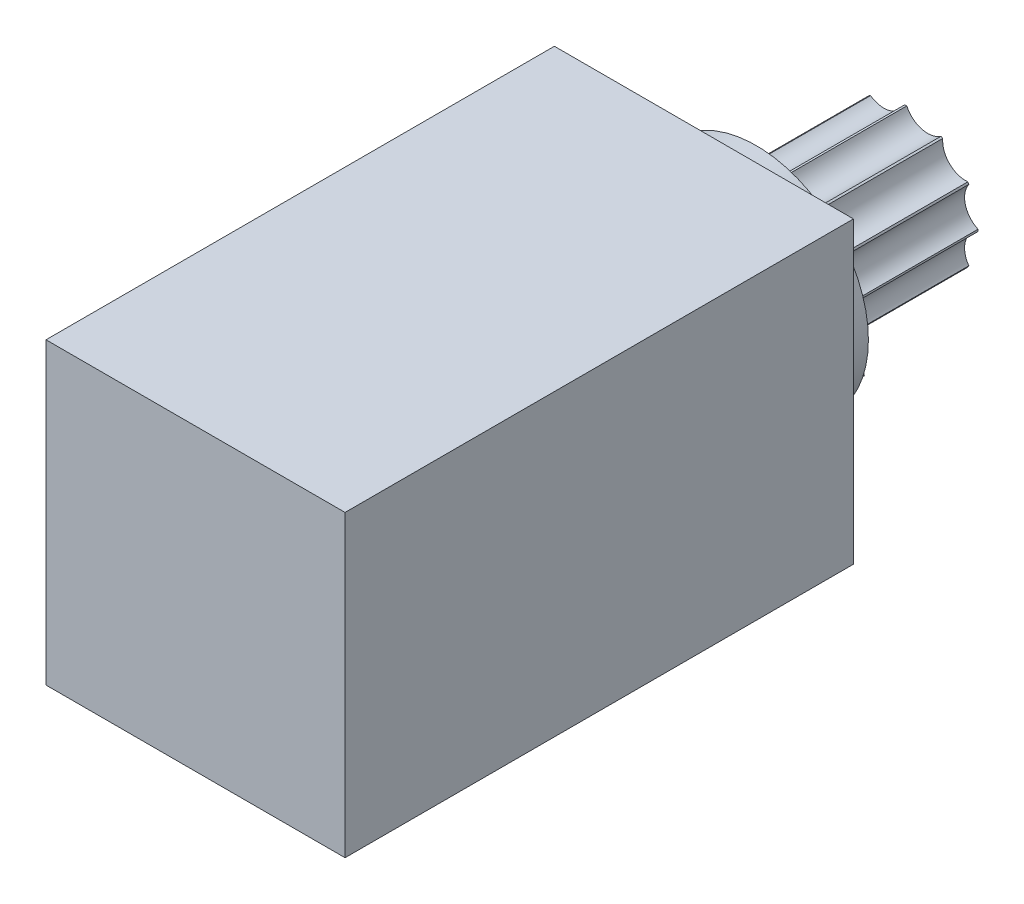
ISO-10303-21;
HEADER;
FILE_DESCRIPTION(('STEP AP214'),'2;1');
FILE_NAME('part.step','',(''),(''),'','','');
FILE_SCHEMA(('AUTOMOTIVE_DESIGN { 1 0 10303 214 1 1 1 1 }'));
ENDSEC;
DATA;
#1=APPLICATION_CONTEXT('core data for automotive mechanical design processes');
#2=APPLICATION_PROTOCOL_DEFINITION('international standard','automotive_design',2000,#1);
#3=PRODUCT_CONTEXT('',#1,'mechanical');
#4=PRODUCT('Part','Part','',(#3));
#5=PRODUCT_RELATED_PRODUCT_CATEGORY('part','',(#4));
#6=PRODUCT_DEFINITION_FORMATION('','',#4);
#7=PRODUCT_DEFINITION_CONTEXT('part definition',#1,'design');
#8=PRODUCT_DEFINITION('design','',#6,#7);
#9=PRODUCT_DEFINITION_SHAPE('','',#8);
#10=(LENGTH_UNIT() NAMED_UNIT(*) SI_UNIT(.MILLI.,.METRE.));
#11=(NAMED_UNIT(*) PLANE_ANGLE_UNIT() SI_UNIT($,.RADIAN.));
#12=(NAMED_UNIT(*) SI_UNIT($,.STERADIAN.) SOLID_ANGLE_UNIT());
#13=UNCERTAINTY_MEASURE_WITH_UNIT(LENGTH_MEASURE(1.E-05),#10,'distance_accuracy_value','');
#14=(GEOMETRIC_REPRESENTATION_CONTEXT(3) GLOBAL_UNCERTAINTY_ASSIGNED_CONTEXT((#13)) GLOBAL_UNIT_ASSIGNED_CONTEXT((#10,
#11,#12)) REPRESENTATION_CONTEXT('',''));
#15=CARTESIAN_POINT('',(0.,0.,0.));
#16=DIRECTION('',(0.,0.,1.));
#17=DIRECTION('',(1.,0.,0.));
#18=AXIS2_PLACEMENT_3D('',#15,#16,#17);
#19=CARTESIAN_POINT('',(0.,0.,0.));
#20=DIRECTION('',(0.,0.,1.));
#21=DIRECTION('',(1.,0.,0.));
#22=AXIS2_PLACEMENT_3D('',#19,#20,#21);
#23=PLANE('',#22);
#24=CARTESIAN_POINT('',(-2.93276025786936,10.9452102887896,0.));
#25=DIRECTION('',(0.,0.,1.));
#26=DIRECTION('',(-1.,0.,0.));
#27=AXIS2_PLACEMENT_3D('',#24,#25,#26);
#28=CIRCLE('',#27,3.08131550156367);
#29=CARTESIAN_POINT('',(-4.71396154001123,8.43088588396958,0.));
#30=VERTEX_POINT('',#29);
#31=CARTESIAN_POINT('',(-0.13303249587147,9.65834212193098,0.));
#32=VERTEX_POINT('',#31);
#33=EDGE_CURVE('E294',#30,#32,#28,.T.);
#34=ORIENTED_EDGE('',*,*,#33,.T.);
#35=DIRECTION('',(1.,0.,0.));
#36=VECTOR('',#35,1.);
#37=CARTESIAN_POINT('',(-0.13303249587147,9.65834212193098,0.));
#38=LINE('',#37,#36);
#39=CARTESIAN_POINT('',(0.133032495872285,9.65834212193096,0.));
#40=VERTEX_POINT('',#39);
#41=EDGE_CURVE('E367',#32,#40,#38,.T.);
#42=ORIENTED_EDGE('',*,*,#41,.T.);
#43=CARTESIAN_POINT('',(2.93276025787025,10.9452102887901,0.));
#44=DIRECTION('',(0.,0.,1.));
#45=DIRECTION('',(-1.,0.,0.));
#46=AXIS2_PLACEMENT_3D('',#43,#44,#45);
#47=CIRCLE('',#46,3.08131550156377);
#48=CARTESIAN_POINT('',(4.71396154001138,8.43088588396955,0.));
#49=VERTEX_POINT('',#48);
#50=EDGE_CURVE('E370',#40,#49,#47,.T.);
#51=ORIENTED_EDGE('',*,*,#50,.T.);
#52=DIRECTION('',(0.866025403784434,-0.500000000000009,0.));
#53=VECTOR('',#52,1.);
#54=CARTESIAN_POINT('',(4.71396154001135,8.43088588396959,0.));
#55=LINE('',#54,#53);
#56=CARTESIAN_POINT('',(4.94438058191977,8.29785338809734,0.));
#57=VERTEX_POINT('',#56);
#58=EDGE_CURVE('E373',#49,#57,#55,.T.);
#59=ORIENTED_EDGE('',*,*,#58,.T.);
#60=CARTESIAN_POINT('',(8.01245003092004,8.01245003091989,0.));
#61=DIRECTION('',(0.,0.,1.));
#62=DIRECTION('',(-1.,0.,0.));
#63=AXIS2_PLACEMENT_3D('',#60,#61,#62);
#64=CIRCLE('',#63,3.08131550156372);
#65=CARTESIAN_POINT('',(8.2978533880973,4.94438058191963,0.));
#66=VERTEX_POINT('',#65);
#67=EDGE_CURVE('E376',#57,#66,#64,.T.);
#68=ORIENTED_EDGE('',*,*,#67,.T.);
#69=DIRECTION('',(0.500000000000075,-0.866025403784395,0.));
#70=VECTOR('',#69,1.);
#71=CARTESIAN_POINT('',(8.2978533880973,4.94438058191965,0.));
#72=LINE('',#71,#70);
#73=CARTESIAN_POINT('',(8.43088588396965,4.7139615400111,0.));
#74=VERTEX_POINT('',#73);
#75=EDGE_CURVE('E379',#66,#74,#72,.T.);
#76=ORIENTED_EDGE('',*,*,#75,.T.);
#77=CARTESIAN_POINT('',(10.9452102887901,2.93276025787003,0.));
#78=DIRECTION('',(0.,0.,1.));
#79=DIRECTION('',(-1.,0.,0.));
#80=AXIS2_PLACEMENT_3D('',#77,#78,#79);
#81=CIRCLE('',#80,3.08131550156376);
#82=CARTESIAN_POINT('',(9.65834212193091,0.133032495872171,0.));
#83=VERTEX_POINT('',#82);
#84=EDGE_CURVE('E382',#74,#83,#81,.T.);
#85=ORIENTED_EDGE('',*,*,#84,.T.);
#86=DIRECTION('',(0.,-1.,0.));
#87=VECTOR('',#86,1.);
#88=CARTESIAN_POINT('',(9.65834212193089,0.133032495872123,0.));
#89=LINE('',#88,#87);
#90=CARTESIAN_POINT('',(9.65834212193088,-0.133032495872416,0.));
#91=VERTEX_POINT('',#90);
#92=EDGE_CURVE('E385',#83,#91,#89,.T.);
#93=ORIENTED_EDGE('',*,*,#92,.T.);
#94=CARTESIAN_POINT('',(10.9452102887901,-2.93276025787022,0.));
#95=DIRECTION('',(0.,0.,1.));
#96=DIRECTION('',(-1.,0.,0.));
#97=AXIS2_PLACEMENT_3D('',#94,#95,#96);
#98=CIRCLE('',#97,3.08131550156376);
#99=CARTESIAN_POINT('',(8.43088588396955,-4.71396154001132,0.));
#100=VERTEX_POINT('',#99);
#101=EDGE_CURVE('E388',#91,#100,#98,.T.);
#102=ORIENTED_EDGE('',*,*,#101,.T.);
#103=DIRECTION('',(-0.499999999999937,-0.866025403784475,0.));
#104=VECTOR('',#103,1.);
#105=CARTESIAN_POINT('',(8.4308858839695,-4.71396154001135,0.));
#106=LINE('',#105,#104);
#107=CARTESIAN_POINT('',(8.29785338809731,-4.94438058191973,0.));
#108=VERTEX_POINT('',#107);
#109=EDGE_CURVE('E391',#100,#108,#106,.T.);
#110=ORIENTED_EDGE('',*,*,#109,.T.);
#111=CARTESIAN_POINT('',(8.0124500309199,-8.01245003092004,0.));
#112=DIRECTION('',(0.,0.,1.));
#113=DIRECTION('',(-1.,0.,0.));
#114=AXIS2_PLACEMENT_3D('',#111,#112,#113);
#115=CIRCLE('',#114,3.08131550156379);
#116=CARTESIAN_POINT('',(4.94438058191957,-8.29785338809738,0.));
#117=VERTEX_POINT('',#116);
#118=EDGE_CURVE('E394',#108,#117,#115,.T.);
#119=ORIENTED_EDGE('',*,*,#118,.T.);
#120=DIRECTION('',(-0.866025403784444,-0.499999999999991,0.));
#121=VECTOR('',#120,1.);
#122=CARTESIAN_POINT('',(4.94438058191956,-8.29785338809738,0.));
#123=LINE('',#122,#121);
#124=CARTESIAN_POINT('',(4.71396154001119,-8.43088588396959,0.));
#125=VERTEX_POINT('',#124);
#126=EDGE_CURVE('E397',#117,#125,#123,.T.);
#127=ORIENTED_EDGE('',*,*,#126,.T.);
#128=CARTESIAN_POINT('',(2.93276025787003,-10.9452102887901,0.));
#129=DIRECTION('',(0.,0.,1.));
#130=DIRECTION('',(-1.,0.,0.));
#131=AXIS2_PLACEMENT_3D('',#128,#129,#130);
#132=CIRCLE('',#131,3.08131550156377);
#133=CARTESIAN_POINT('',(0.133032495872173,-9.65834212193088,0.));
#134=VERTEX_POINT('',#133);
#135=EDGE_CURVE('E400',#125,#134,#132,.T.);
#136=ORIENTED_EDGE('',*,*,#135,.T.);
#137=DIRECTION('',(-1.,0.,0.));
#138=VECTOR('',#137,1.);
#139=CARTESIAN_POINT('',(0.133032495872204,-9.6583421219309,0.));
#140=LINE('',#139,#138);
#141=CARTESIAN_POINT('',(-0.133032495872356,-9.6583421219309,0.));
#142=VERTEX_POINT('',#141);
#143=EDGE_CURVE('E403',#134,#142,#140,.T.);
#144=ORIENTED_EDGE('',*,*,#143,.T.);
#145=CARTESIAN_POINT('',(-2.93276025787022,-10.9452102887901,0.));
#146=DIRECTION('',(0.,0.,1.));
#147=DIRECTION('',(-1.,0.,0.));
#148=AXIS2_PLACEMENT_3D('',#145,#146,#147);
#149=CIRCLE('',#148,3.08131550156372);
#150=CARTESIAN_POINT('',(-4.71396154001126,-8.43088588396955,0.));
#151=VERTEX_POINT('',#150);
#152=EDGE_CURVE('E406',#142,#151,#149,.T.);
#153=ORIENTED_EDGE('',*,*,#152,.T.);
#154=DIRECTION('',(-0.866025403784452,0.499999999999976,0.));
#155=VECTOR('',#154,1.);
#156=CARTESIAN_POINT('',(-4.71396154001125,-8.43088588396957,0.));
#157=LINE('',#156,#155);
#158=CARTESIAN_POINT('',(-4.94438058191978,-8.29785338809727,0.));
#159=VERTEX_POINT('',#158);
#160=EDGE_CURVE('E409',#151,#159,#157,.T.);
#161=ORIENTED_EDGE('',*,*,#160,.T.);
#162=CARTESIAN_POINT('',(-8.01245003092006,-8.01245003091989,0.));
#163=DIRECTION('',(0.,0.,1.));
#164=DIRECTION('',(-1.,0.,0.));
#165=AXIS2_PLACEMENT_3D('',#162,#163,#164);
#166=CIRCLE('',#165,3.08131550156371);
#167=CARTESIAN_POINT('',(-8.29785338809734,-4.94438058191963,0.));
#168=VERTEX_POINT('',#167);
#169=EDGE_CURVE('E412',#159,#168,#166,.T.);
#170=ORIENTED_EDGE('',*,*,#169,.T.);
#171=DIRECTION('',(-0.499999999999894,0.8660254037845,0.));
#172=VECTOR('',#171,1.);
#173=CARTESIAN_POINT('',(-8.29785338809734,-4.94438058191965,0.));
#174=LINE('',#173,#172);
#175=CARTESIAN_POINT('',(-8.43088588396961,-4.71396154001113,0.));
#176=VERTEX_POINT('',#175);
#177=EDGE_CURVE('E415',#168,#176,#174,.T.);
#178=ORIENTED_EDGE('',*,*,#177,.T.);
#179=CARTESIAN_POINT('',(-10.9452102887901,-2.93276025787,0.));
#180=DIRECTION('',(0.,0.,1.));
#181=DIRECTION('',(-1.,0.,0.));
#182=AXIS2_PLACEMENT_3D('',#179,#180,#181);
#183=CIRCLE('',#182,3.08131550156374);
#184=CARTESIAN_POINT('',(-9.65834212193084,-0.133032495872213,0.));
#185=VERTEX_POINT('',#184);
#186=EDGE_CURVE('E418',#176,#185,#183,.T.);
#187=ORIENTED_EDGE('',*,*,#186,.T.);
#188=DIRECTION('',(0.,1.,0.));
#189=VECTOR('',#188,1.);
#190=CARTESIAN_POINT('',(-9.65834212193088,0.133032495872454,0.));
#191=LINE('',#190,#189);
#192=CARTESIAN_POINT('',(-9.65834212193088,0.133032495872454,0.));
#193=VERTEX_POINT('',#192);
#194=EDGE_CURVE('E421',#185,#193,#191,.T.);
#195=ORIENTED_EDGE('',*,*,#194,.T.);
#196=CARTESIAN_POINT('',(-10.9452102887901,2.93276025787025,0.));
#197=DIRECTION('',(0.,0.,1.));
#198=DIRECTION('',(-1.,0.,0.));
#199=AXIS2_PLACEMENT_3D('',#196,#197,#198);
#200=CIRCLE('',#199,3.08131550156368);
#201=CARTESIAN_POINT('',(-8.43088588396956,4.71396154001123,0.));
#202=VERTEX_POINT('',#201);
#203=EDGE_CURVE('E424',#193,#202,#200,.T.);
#204=ORIENTED_EDGE('',*,*,#203,.T.);
#205=DIRECTION('',(0.5,0.866025403784439,0.));
#206=VECTOR('',#205,1.);
#207=CARTESIAN_POINT('',(-8.29785338809726,4.94438058191977,0.));
#208=LINE('',#207,#206);
#209=CARTESIAN_POINT('',(-8.29785338809726,4.94438058191977,0.));
#210=VERTEX_POINT('',#209);
#211=EDGE_CURVE('E427',#202,#210,#208,.T.);
#212=ORIENTED_EDGE('',*,*,#211,.T.);
#213=CARTESIAN_POINT('',(-8.01245003091988,8.01245003092007,0.));
#214=DIRECTION('',(0.,0.,1.));
#215=DIRECTION('',(-1.,0.,0.));
#216=AXIS2_PLACEMENT_3D('',#213,#214,#215);
#217=CIRCLE('',#216,3.08131550156373);
#218=CARTESIAN_POINT('',(-4.9443805819196,8.29785338809735,0.));
#219=VERTEX_POINT('',#218);
#220=EDGE_CURVE('E430',#210,#219,#217,.T.);
#221=ORIENTED_EDGE('',*,*,#220,.T.);
#222=DIRECTION('',(0.866025403784433,0.50000000000001,0.));
#223=VECTOR('',#222,1.);
#224=CARTESIAN_POINT('',(-4.71396154001123,8.43088588396958,0.));
#225=LINE('',#224,#223);
#226=EDGE_CURVE('E299',#219,#30,#225,.T.);
#227=ORIENTED_EDGE('',*,*,#226,.T.);
#228=EDGE_LOOP('',(#34,#42,#51,#59,#68,#76,#85,#93,#102,#110,#119,#127,#136,#144,#153,#161,#170,
#178,#187,#195,#204,#212,#221,#227));
#229=FACE_BOUND('',#228,.T.);
#230=ADVANCED_FACE('F50',(#229),#23,.F.);
#231=CARTESIAN_POINT('',(-2.93276025786936,10.9452102887896,20.));
#232=DIRECTION('',(0.,0.,-1.));
#233=DIRECTION('',(-1.,0.,0.));
#234=AXIS2_PLACEMENT_3D('',#231,#232,#233);
#235=CYLINDRICAL_SURFACE('',#234,3.08131550156367);
#236=ORIENTED_EDGE('',*,*,#33,.F.);
#237=DIRECTION('',(0.,0.,-1.));
#238=VECTOR('',#237,1.);
#239=CARTESIAN_POINT('',(-4.71396154001123,8.43088588396958,20.));
#240=LINE('',#239,#238);
#241=CARTESIAN_POINT('',(-4.71396154001123,8.43088588396958,20.));
#242=VERTEX_POINT('',#241);
#243=EDGE_CURVE('E12',#242,#30,#240,.T.);
#244=ORIENTED_EDGE('',*,*,#243,.F.);
#245=CARTESIAN_POINT('',(-2.93276025786936,10.9452102887896,20.));
#246=DIRECTION('',(0.,0.,1.));
#247=DIRECTION('',(-1.,0.,0.));
#248=AXIS2_PLACEMENT_3D('',#245,#246,#247);
#249=CIRCLE('',#248,3.08131550156367);
#250=CARTESIAN_POINT('',(-0.13303249587147,9.65834212193098,20.));
#251=VERTEX_POINT('',#250);
#252=EDGE_CURVE('E295',#242,#251,#249,.T.);
#253=ORIENTED_EDGE('',*,*,#252,.T.);
#254=DIRECTION('',(0.,0.,-1.));
#255=VECTOR('',#254,1.);
#256=CARTESIAN_POINT('',(-0.13303249587147,9.65834212193098,20.));
#257=LINE('',#256,#255);
#258=EDGE_CURVE('E53',#251,#32,#257,.T.);
#259=ORIENTED_EDGE('',*,*,#258,.T.);
#260=EDGE_LOOP('',(#236,#244,#253,#259));
#261=FACE_BOUND('',#260,.T.);
#262=ADVANCED_FACE('F486',(#261),#235,.F.);
#263=CARTESIAN_POINT('',(-4.71396154001123,8.43088588396958,20.));
#264=DIRECTION('',(-0.50000000000001,0.866025403784433,0.));
#265=DIRECTION('',(-0.866025403784433,-0.50000000000001,0.));
#266=AXIS2_PLACEMENT_3D('',#263,#264,#265);
#267=PLANE('',#266);
#268=ORIENTED_EDGE('',*,*,#226,.F.);
#269=DIRECTION('',(0.,0.,-1.));
#270=VECTOR('',#269,1.);
#271=CARTESIAN_POINT('',(-4.9443805819196,8.29785338809735,20.));
#272=LINE('',#271,#270);
#273=CARTESIAN_POINT('',(-4.9443805819196,8.29785338809735,20.));
#274=VERTEX_POINT('',#273);
#275=EDGE_CURVE('E58',#274,#219,#272,.T.);
#276=ORIENTED_EDGE('',*,*,#275,.F.);
#277=DIRECTION('',(0.866025403784433,0.50000000000001,0.));
#278=VECTOR('',#277,1.);
#279=CARTESIAN_POINT('',(-4.71396154001123,8.43088588396958,20.));
#280=LINE('',#279,#278);
#281=EDGE_CURVE('E362',#274,#242,#280,.T.);
#282=ORIENTED_EDGE('',*,*,#281,.T.);
#283=ORIENTED_EDGE('',*,*,#243,.T.);
#284=EDGE_LOOP('',(#268,#276,#282,#283));
#285=FACE_BOUND('',#284,.T.);
#286=ADVANCED_FACE('F494',(#285),#267,.T.);
#287=CARTESIAN_POINT('',(-8.01245003091988,8.01245003092007,20.));
#288=DIRECTION('',(0.,0.,-1.));
#289=DIRECTION('',(-1.,0.,0.));
#290=AXIS2_PLACEMENT_3D('',#287,#288,#289);
#291=CYLINDRICAL_SURFACE('',#290,3.08131550156373);
#292=ORIENTED_EDGE('',*,*,#220,.F.);
#293=DIRECTION('',(0.,0.,-1.));
#294=VECTOR('',#293,1.);
#295=CARTESIAN_POINT('',(-8.29785338809726,4.94438058191977,20.));
#296=LINE('',#295,#294);
#297=CARTESIAN_POINT('',(-8.29785338809726,4.94438058191977,20.));
#298=VERTEX_POINT('',#297);
#299=EDGE_CURVE('E436',#298,#210,#296,.T.);
#300=ORIENTED_EDGE('',*,*,#299,.F.);
#301=CARTESIAN_POINT('',(-8.01245003091988,8.01245003092007,20.));
#302=DIRECTION('',(0.,0.,1.));
#303=DIRECTION('',(-1.,0.,0.));
#304=AXIS2_PLACEMENT_3D('',#301,#302,#303);
#305=CIRCLE('',#304,3.08131550156373);
#306=EDGE_CURVE('E359',#298,#274,#305,.T.);
#307=ORIENTED_EDGE('',*,*,#306,.T.);
#308=ORIENTED_EDGE('',*,*,#275,.T.);
#309=EDGE_LOOP('',(#292,#300,#307,#308));
#310=FACE_BOUND('',#309,.T.);
#311=ADVANCED_FACE('F580',(#310),#291,.F.);
#312=CARTESIAN_POINT('',(-8.29785338809726,4.94438058191977,20.));
#313=DIRECTION('',(-0.866025403784439,0.5,0.));
#314=DIRECTION('',(-0.5,-0.866025403784439,0.));
#315=AXIS2_PLACEMENT_3D('',#312,#313,#314);
#316=PLANE('',#315);
#317=ORIENTED_EDGE('',*,*,#211,.F.);
#318=DIRECTION('',(0.,0.,-1.));
#319=VECTOR('',#318,1.);
#320=CARTESIAN_POINT('',(-8.43088588396956,4.71396154001123,20.));
#321=LINE('',#320,#319);
#322=CARTESIAN_POINT('',(-8.43088588396956,4.71396154001123,20.));
#323=VERTEX_POINT('',#322);
#324=EDGE_CURVE('E438',#323,#202,#321,.T.);
#325=ORIENTED_EDGE('',*,*,#324,.F.);
#326=DIRECTION('',(0.5,0.866025403784439,0.));
#327=VECTOR('',#326,1.);
#328=CARTESIAN_POINT('',(-8.29785338809726,4.94438058191977,20.));
#329=LINE('',#328,#327);
#330=EDGE_CURVE('E356',#323,#298,#329,.T.);
#331=ORIENTED_EDGE('',*,*,#330,.T.);
#332=ORIENTED_EDGE('',*,*,#299,.T.);
#333=EDGE_LOOP('',(#317,#325,#331,#332));
#334=FACE_BOUND('',#333,.T.);
#335=ADVANCED_FACE('F578',(#334),#316,.T.);
#336=CARTESIAN_POINT('',(-10.9452102887901,2.93276025787025,20.));
#337=DIRECTION('',(0.,0.,-1.));
#338=DIRECTION('',(-1.,0.,0.));
#339=AXIS2_PLACEMENT_3D('',#336,#337,#338);
#340=CYLINDRICAL_SURFACE('',#339,3.08131550156368);
#341=ORIENTED_EDGE('',*,*,#203,.F.);
#342=DIRECTION('',(0.,0.,-1.));
#343=VECTOR('',#342,1.);
#344=CARTESIAN_POINT('',(-9.65834212193088,0.133032495872454,20.));
#345=LINE('',#344,#343);
#346=CARTESIAN_POINT('',(-9.65834212193088,0.133032495872454,20.));
#347=VERTEX_POINT('',#346);
#348=EDGE_CURVE('E440',#347,#193,#345,.T.);
#349=ORIENTED_EDGE('',*,*,#348,.F.);
#350=CARTESIAN_POINT('',(-10.9452102887901,2.93276025787025,20.));
#351=DIRECTION('',(0.,0.,1.));
#352=DIRECTION('',(-1.,0.,0.));
#353=AXIS2_PLACEMENT_3D('',#350,#351,#352);
#354=CIRCLE('',#353,3.08131550156368);
#355=EDGE_CURVE('E353',#347,#323,#354,.T.);
#356=ORIENTED_EDGE('',*,*,#355,.T.);
#357=ORIENTED_EDGE('',*,*,#324,.T.);
#358=EDGE_LOOP('',(#341,#349,#356,#357));
#359=FACE_BOUND('',#358,.T.);
#360=ADVANCED_FACE('F574',(#359),#340,.F.);
#361=CARTESIAN_POINT('',(-9.65834212193088,0.133032495872454,20.));
#362=DIRECTION('',(-1.,0.,0.));
#363=DIRECTION('',(0.,-1.,0.));
#364=AXIS2_PLACEMENT_3D('',#361,#362,#363);
#365=PLANE('',#364);
#366=ORIENTED_EDGE('',*,*,#194,.F.);
#367=DIRECTION('',(0.,0.,-1.));
#368=VECTOR('',#367,1.);
#369=CARTESIAN_POINT('',(-9.65834212193084,-0.133032495872213,20.));
#370=LINE('',#369,#368);
#371=CARTESIAN_POINT('',(-9.65834212193084,-0.133032495872213,20.));
#372=VERTEX_POINT('',#371);
#373=EDGE_CURVE('E442',#372,#185,#370,.T.);
#374=ORIENTED_EDGE('',*,*,#373,.F.);
#375=DIRECTION('',(0.,1.,0.));
#376=VECTOR('',#375,1.);
#377=CARTESIAN_POINT('',(-9.65834212193088,0.133032495872454,20.));
#378=LINE('',#377,#376);
#379=EDGE_CURVE('E350',#372,#347,#378,.T.);
#380=ORIENTED_EDGE('',*,*,#379,.T.);
#381=ORIENTED_EDGE('',*,*,#348,.T.);
#382=EDGE_LOOP('',(#366,#374,#380,#381));
#383=FACE_BOUND('',#382,.T.);
#384=ADVANCED_FACE('F570',(#383),#365,.T.);
#385=CARTESIAN_POINT('',(-10.9452102887901,-2.93276025787,20.));
#386=DIRECTION('',(0.,0.,-1.));
#387=DIRECTION('',(-1.,0.,0.));
#388=AXIS2_PLACEMENT_3D('',#385,#386,#387);
#389=CYLINDRICAL_SURFACE('',#388,3.08131550156374);
#390=ORIENTED_EDGE('',*,*,#186,.F.);
#391=DIRECTION('',(0.,0.,-1.));
#392=VECTOR('',#391,1.);
#393=CARTESIAN_POINT('',(-8.43088588396961,-4.71396154001113,20.));
#394=LINE('',#393,#392);
#395=CARTESIAN_POINT('',(-8.43088588396961,-4.71396154001113,20.));
#396=VERTEX_POINT('',#395);
#397=EDGE_CURVE('E444',#396,#176,#394,.T.);
#398=ORIENTED_EDGE('',*,*,#397,.F.);
#399=CARTESIAN_POINT('',(-10.9452102887901,-2.93276025787,20.));
#400=DIRECTION('',(0.,0.,1.));
#401=DIRECTION('',(-1.,0.,0.));
#402=AXIS2_PLACEMENT_3D('',#399,#400,#401);
#403=CIRCLE('',#402,3.08131550156374);
#404=EDGE_CURVE('E347',#396,#372,#403,.T.);
#405=ORIENTED_EDGE('',*,*,#404,.T.);
#406=ORIENTED_EDGE('',*,*,#373,.T.);
#407=EDGE_LOOP('',(#390,#398,#405,#406));
#408=FACE_BOUND('',#407,.T.);
#409=ADVANCED_FACE('F567',(#408),#389,.F.);
#410=CARTESIAN_POINT('',(-8.29785338809734,-4.94438058191965,20.));
#411=DIRECTION('',(-0.8660254037845,-0.499999999999894,0.));
#412=DIRECTION('',(0.499999999999894,-0.8660254037845,0.));
#413=AXIS2_PLACEMENT_3D('',#410,#411,#412);
#414=PLANE('',#413);
#415=ORIENTED_EDGE('',*,*,#177,.F.);
#416=DIRECTION('',(0.,0.,-1.));
#417=VECTOR('',#416,1.);
#418=CARTESIAN_POINT('',(-8.29785338809734,-4.94438058191963,20.));
#419=LINE('',#418,#417);
#420=CARTESIAN_POINT('',(-8.29785338809734,-4.94438058191963,20.));
#421=VERTEX_POINT('',#420);
#422=EDGE_CURVE('E446',#421,#168,#419,.T.);
#423=ORIENTED_EDGE('',*,*,#422,.F.);
#424=DIRECTION('',(-0.499999999999894,0.8660254037845,0.));
#425=VECTOR('',#424,1.);
#426=CARTESIAN_POINT('',(-8.29785338809734,-4.94438058191965,20.));
#427=LINE('',#426,#425);
#428=EDGE_CURVE('E344',#421,#396,#427,.T.);
#429=ORIENTED_EDGE('',*,*,#428,.T.);
#430=ORIENTED_EDGE('',*,*,#397,.T.);
#431=EDGE_LOOP('',(#415,#423,#429,#430));
#432=FACE_BOUND('',#431,.T.);
#433=ADVANCED_FACE('F562',(#432),#414,.T.);
#434=CARTESIAN_POINT('',(-8.01245003092006,-8.01245003091989,20.));
#435=DIRECTION('',(0.,0.,-1.));
#436=DIRECTION('',(-1.,0.,0.));
#437=AXIS2_PLACEMENT_3D('',#434,#435,#436);
#438=CYLINDRICAL_SURFACE('',#437,3.08131550156371);
#439=ORIENTED_EDGE('',*,*,#169,.F.);
#440=DIRECTION('',(0.,0.,-1.));
#441=VECTOR('',#440,1.);
#442=CARTESIAN_POINT('',(-4.94438058191978,-8.29785338809727,20.));
#443=LINE('',#442,#441);
#444=CARTESIAN_POINT('',(-4.94438058191978,-8.29785338809727,20.));
#445=VERTEX_POINT('',#444);
#446=EDGE_CURVE('E448',#445,#159,#443,.T.);
#447=ORIENTED_EDGE('',*,*,#446,.F.);
#448=CARTESIAN_POINT('',(-8.01245003092006,-8.01245003091989,20.));
#449=DIRECTION('',(0.,0.,1.));
#450=DIRECTION('',(-1.,0.,0.));
#451=AXIS2_PLACEMENT_3D('',#448,#449,#450);
#452=CIRCLE('',#451,3.08131550156371);
#453=EDGE_CURVE('E341',#445,#421,#452,.T.);
#454=ORIENTED_EDGE('',*,*,#453,.T.);
#455=ORIENTED_EDGE('',*,*,#422,.T.);
#456=EDGE_LOOP('',(#439,#447,#454,#455));
#457=FACE_BOUND('',#456,.T.);
#458=ADVANCED_FACE('F558',(#457),#438,.F.);
#459=CARTESIAN_POINT('',(-4.71396154001125,-8.43088588396957,20.));
#460=DIRECTION('',(-0.499999999999976,-0.866025403784452,0.));
#461=DIRECTION('',(0.866025403784452,-0.499999999999976,0.));
#462=AXIS2_PLACEMENT_3D('',#459,#460,#461);
#463=PLANE('',#462);
#464=ORIENTED_EDGE('',*,*,#160,.F.);
#465=DIRECTION('',(0.,0.,-1.));
#466=VECTOR('',#465,1.);
#467=CARTESIAN_POINT('',(-4.71396154001126,-8.43088588396955,20.));
#468=LINE('',#467,#466);
#469=CARTESIAN_POINT('',(-4.71396154001126,-8.43088588396955,20.));
#470=VERTEX_POINT('',#469);
#471=EDGE_CURVE('E450',#470,#151,#468,.T.);
#472=ORIENTED_EDGE('',*,*,#471,.F.);
#473=DIRECTION('',(-0.866025403784452,0.499999999999976,0.));
#474=VECTOR('',#473,1.);
#475=CARTESIAN_POINT('',(-4.71396154001125,-8.43088588396957,20.));
#476=LINE('',#475,#474);
#477=EDGE_CURVE('E338',#470,#445,#476,.T.);
#478=ORIENTED_EDGE('',*,*,#477,.T.);
#479=ORIENTED_EDGE('',*,*,#446,.T.);
#480=EDGE_LOOP('',(#464,#472,#478,#479));
#481=FACE_BOUND('',#480,.T.);
#482=ADVANCED_FACE('F555',(#481),#463,.T.);
#483=CARTESIAN_POINT('',(-2.93276025787022,-10.9452102887901,20.));
#484=DIRECTION('',(0.,0.,-1.));
#485=DIRECTION('',(-1.,0.,0.));
#486=AXIS2_PLACEMENT_3D('',#483,#484,#485);
#487=CYLINDRICAL_SURFACE('',#486,3.08131550156372);
#488=ORIENTED_EDGE('',*,*,#152,.F.);
#489=DIRECTION('',(0.,0.,-1.));
#490=VECTOR('',#489,1.);
#491=CARTESIAN_POINT('',(-0.133032495872356,-9.6583421219309,20.));
#492=LINE('',#491,#490);
#493=CARTESIAN_POINT('',(-0.133032495872356,-9.6583421219309,20.));
#494=VERTEX_POINT('',#493);
#495=EDGE_CURVE('E452',#494,#142,#492,.T.);
#496=ORIENTED_EDGE('',*,*,#495,.F.);
#497=CARTESIAN_POINT('',(-2.93276025787022,-10.9452102887901,20.));
#498=DIRECTION('',(0.,0.,1.));
#499=DIRECTION('',(-1.,0.,0.));
#500=AXIS2_PLACEMENT_3D('',#497,#498,#499);
#501=CIRCLE('',#500,3.08131550156372);
#502=EDGE_CURVE('E335',#494,#470,#501,.T.);
#503=ORIENTED_EDGE('',*,*,#502,.T.);
#504=ORIENTED_EDGE('',*,*,#471,.T.);
#505=EDGE_LOOP('',(#488,#496,#503,#504));
#506=FACE_BOUND('',#505,.T.);
#507=ADVANCED_FACE('F550',(#506),#487,.F.);
#508=CARTESIAN_POINT('',(0.133032495872204,-9.6583421219309,20.));
#509=DIRECTION('',(0.,-1.,0.));
#510=DIRECTION('',(1.,0.,0.));
#511=AXIS2_PLACEMENT_3D('',#508,#509,#510);
#512=PLANE('',#511);
#513=ORIENTED_EDGE('',*,*,#143,.F.);
#514=DIRECTION('',(0.,0.,-1.));
#515=VECTOR('',#514,1.);
#516=CARTESIAN_POINT('',(0.133032495872173,-9.65834212193088,20.));
#517=LINE('',#516,#515);
#518=CARTESIAN_POINT('',(0.133032495872173,-9.65834212193088,20.));
#519=VERTEX_POINT('',#518);
#520=EDGE_CURVE('E454',#519,#134,#517,.T.);
#521=ORIENTED_EDGE('',*,*,#520,.F.);
#522=DIRECTION('',(-1.,0.,0.));
#523=VECTOR('',#522,1.);
#524=CARTESIAN_POINT('',(0.133032495872204,-9.6583421219309,20.));
#525=LINE('',#524,#523);
#526=EDGE_CURVE('E332',#519,#494,#525,.T.);
#527=ORIENTED_EDGE('',*,*,#526,.T.);
#528=ORIENTED_EDGE('',*,*,#495,.T.);
#529=EDGE_LOOP('',(#513,#521,#527,#528));
#530=FACE_BOUND('',#529,.T.);
#531=ADVANCED_FACE('F546',(#530),#512,.T.);
#532=CARTESIAN_POINT('',(2.93276025787003,-10.9452102887901,20.));
#533=DIRECTION('',(0.,0.,-1.));
#534=DIRECTION('',(-1.,0.,0.));
#535=AXIS2_PLACEMENT_3D('',#532,#533,#534);
#536=CYLINDRICAL_SURFACE('',#535,3.08131550156377);
#537=ORIENTED_EDGE('',*,*,#135,.F.);
#538=DIRECTION('',(0.,0.,-1.));
#539=VECTOR('',#538,1.);
#540=CARTESIAN_POINT('',(4.71396154001119,-8.43088588396959,20.));
#541=LINE('',#540,#539);
#542=CARTESIAN_POINT('',(4.71396154001119,-8.43088588396959,20.));
#543=VERTEX_POINT('',#542);
#544=EDGE_CURVE('E456',#543,#125,#541,.T.);
#545=ORIENTED_EDGE('',*,*,#544,.F.);
#546=CARTESIAN_POINT('',(2.93276025787003,-10.9452102887901,20.));
#547=DIRECTION('',(0.,0.,1.));
#548=DIRECTION('',(-1.,0.,0.));
#549=AXIS2_PLACEMENT_3D('',#546,#547,#548);
#550=CIRCLE('',#549,3.08131550156377);
#551=EDGE_CURVE('E329',#543,#519,#550,.T.);
#552=ORIENTED_EDGE('',*,*,#551,.T.);
#553=ORIENTED_EDGE('',*,*,#520,.T.);
#554=EDGE_LOOP('',(#537,#545,#552,#553));
#555=FACE_BOUND('',#554,.T.);
#556=ADVANCED_FACE('F543',(#555),#536,.F.);
#557=CARTESIAN_POINT('',(4.94438058191956,-8.29785338809738,20.));
#558=DIRECTION('',(0.499999999999991,-0.866025403784444,0.));
#559=DIRECTION('',(0.866025403784444,0.499999999999991,0.));
#560=AXIS2_PLACEMENT_3D('',#557,#558,#559);
#561=PLANE('',#560);
#562=ORIENTED_EDGE('',*,*,#126,.F.);
#563=DIRECTION('',(0.,0.,-1.));
#564=VECTOR('',#563,1.);
#565=CARTESIAN_POINT('',(4.94438058191957,-8.29785338809738,20.));
#566=LINE('',#565,#564);
#567=CARTESIAN_POINT('',(4.94438058191957,-8.29785338809738,15.));
#568=VERTEX_POINT('',#567);
#569=EDGE_CURVE('E460',#568,#117,#566,.T.);
#570=ORIENTED_EDGE('',*,*,#569,.F.);
#571=CARTESIAN_POINT('',(4.94438058191957,-8.29785338809738,20.));
#572=VERTEX_POINT('',#571);
#573=EDGE_CURVE('E458',#572,#568,#566,.T.);
#574=ORIENTED_EDGE('',*,*,#573,.F.);
#575=DIRECTION('',(-0.866025403784444,-0.499999999999991,0.));
#576=VECTOR('',#575,1.);
#577=CARTESIAN_POINT('',(4.94438058191956,-8.29785338809738,20.));
#578=LINE('',#577,#576);
#579=EDGE_CURVE('E326',#572,#543,#578,.T.);
#580=ORIENTED_EDGE('',*,*,#579,.T.);
#581=ORIENTED_EDGE('',*,*,#544,.T.);
#582=EDGE_LOOP('',(#562,#570,#574,#580,#581));
#583=FACE_BOUND('',#582,.T.);
#584=ADVANCED_FACE('F538',(#583),#561,.T.);
#585=CARTESIAN_POINT('',(8.0124500309199,-8.01245003092004,20.));
#586=DIRECTION('',(0.,0.,-1.));
#587=DIRECTION('',(-1.,0.,0.));
#588=AXIS2_PLACEMENT_3D('',#585,#586,#587);
#589=CYLINDRICAL_SURFACE('',#588,3.08131550156379);
#590=CARTESIAN_POINT('',(8.0124500309199,-8.01245003092004,15.));
#591=DIRECTION('',(0.,0.,-1.));
#592=DIRECTION('',(-1.,0.,0.));
#593=AXIS2_PLACEMENT_3D('',#590,#591,#592);
#594=CIRCLE('',#593,3.08131550156379);
#595=CARTESIAN_POINT('',(8.29785338809731,-4.94438058191973,15.));
#596=VERTEX_POINT('',#595);
#597=EDGE_CURVE('E284',#568,#596,#594,.T.);
#598=ORIENTED_EDGE('',*,*,#597,.F.);
#599=ORIENTED_EDGE('',*,*,#569,.T.);
#600=ORIENTED_EDGE('',*,*,#118,.F.);
#601=DIRECTION('',(0.,0.,-1.));
#602=VECTOR('',#601,1.);
#603=CARTESIAN_POINT('',(8.29785338809731,-4.94438058191973,20.));
#604=LINE('',#603,#602);
#605=EDGE_CURVE('E464',#596,#108,#604,.T.);
#606=ORIENTED_EDGE('',*,*,#605,.F.);
#607=EDGE_LOOP('',(#598,#599,#600,#606));
#608=FACE_BOUND('',#607,.T.);
#609=ADVANCED_FACE('F533',(#608),#589,.F.);
#610=CARTESIAN_POINT('',(8.4308858839695,-4.71396154001135,20.));
#611=DIRECTION('',(0.866025403784475,-0.499999999999937,0.));
#612=DIRECTION('',(0.499999999999937,0.866025403784475,0.));
#613=AXIS2_PLACEMENT_3D('',#610,#611,#612);
#614=PLANE('',#613);
#615=ORIENTED_EDGE('',*,*,#109,.F.);
#616=DIRECTION('',(0.,0.,-1.));
#617=VECTOR('',#616,1.);
#618=CARTESIAN_POINT('',(8.43088588396955,-4.71396154001132,20.));
#619=LINE('',#618,#617);
#620=CARTESIAN_POINT('',(8.43088588396955,-4.71396154001132,20.));
#621=VERTEX_POINT('',#620);
#622=EDGE_CURVE('E465',#621,#100,#619,.T.);
#623=ORIENTED_EDGE('',*,*,#622,.F.);
#624=DIRECTION('',(-0.499999999999937,-0.866025403784475,0.));
#625=VECTOR('',#624,1.);
#626=CARTESIAN_POINT('',(8.4308858839695,-4.71396154001135,20.));
#627=LINE('',#626,#625);
#628=CARTESIAN_POINT('',(8.29785338809731,-4.94438058191973,20.));
#629=VERTEX_POINT('',#628);
#630=EDGE_CURVE('E323',#621,#629,#627,.T.);
#631=ORIENTED_EDGE('',*,*,#630,.T.);
#632=EDGE_CURVE('E461',#629,#596,#604,.T.);
#633=ORIENTED_EDGE('',*,*,#632,.T.);
#634=ORIENTED_EDGE('',*,*,#605,.T.);
#635=EDGE_LOOP('',(#615,#623,#631,#633,#634));
#636=FACE_BOUND('',#635,.T.);
#637=ADVANCED_FACE('F529',(#636),#614,.T.);
#638=CARTESIAN_POINT('',(10.9452102887901,-2.93276025787022,20.));
#639=DIRECTION('',(0.,0.,-1.));
#640=DIRECTION('',(-1.,0.,0.));
#641=AXIS2_PLACEMENT_3D('',#638,#639,#640);
#642=CYLINDRICAL_SURFACE('',#641,3.08131550156376);
#643=ORIENTED_EDGE('',*,*,#101,.F.);
#644=DIRECTION('',(0.,0.,-1.));
#645=VECTOR('',#644,1.);
#646=CARTESIAN_POINT('',(9.65834212193088,-0.133032495872416,20.));
#647=LINE('',#646,#645);
#648=CARTESIAN_POINT('',(9.65834212193088,-0.133032495872416,20.));
#649=VERTEX_POINT('',#648);
#650=EDGE_CURVE('E467',#649,#91,#647,.T.);
#651=ORIENTED_EDGE('',*,*,#650,.F.);
#652=CARTESIAN_POINT('',(10.9452102887901,-2.93276025787022,20.));
#653=DIRECTION('',(0.,0.,1.));
#654=DIRECTION('',(-1.,0.,0.));
#655=AXIS2_PLACEMENT_3D('',#652,#653,#654);
#656=CIRCLE('',#655,3.08131550156376);
#657=EDGE_CURVE('E320',#649,#621,#656,.T.);
#658=ORIENTED_EDGE('',*,*,#657,.T.);
#659=ORIENTED_EDGE('',*,*,#622,.T.);
#660=EDGE_LOOP('',(#643,#651,#658,#659));
#661=FACE_BOUND('',#660,.T.);
#662=ADVANCED_FACE('F524',(#661),#642,.F.);
#663=CARTESIAN_POINT('',(9.65834212193089,0.133032495872123,20.));
#664=DIRECTION('',(1.,0.,0.));
#665=DIRECTION('',(0.,1.,0.));
#666=AXIS2_PLACEMENT_3D('',#663,#664,#665);
#667=PLANE('',#666);
#668=ORIENTED_EDGE('',*,*,#92,.F.);
#669=DIRECTION('',(0.,0.,-1.));
#670=VECTOR('',#669,1.);
#671=CARTESIAN_POINT('',(9.65834212193091,0.133032495872171,20.));
#672=LINE('',#671,#670);
#673=CARTESIAN_POINT('',(9.65834212193091,0.133032495872171,20.));
#674=VERTEX_POINT('',#673);
#675=EDGE_CURVE('E469',#674,#83,#672,.T.);
#676=ORIENTED_EDGE('',*,*,#675,.F.);
#677=DIRECTION('',(0.,-1.,0.));
#678=VECTOR('',#677,1.);
#679=CARTESIAN_POINT('',(9.65834212193089,0.133032495872123,20.));
#680=LINE('',#679,#678);
#681=EDGE_CURVE('E317',#674,#649,#680,.T.);
#682=ORIENTED_EDGE('',*,*,#681,.T.);
#683=ORIENTED_EDGE('',*,*,#650,.T.);
#684=EDGE_LOOP('',(#668,#676,#682,#683));
#685=FACE_BOUND('',#684,.T.);
#686=ADVANCED_FACE('F520',(#685),#667,.T.);
#687=CARTESIAN_POINT('',(10.9452102887901,2.93276025787003,20.));
#688=DIRECTION('',(0.,0.,-1.));
#689=DIRECTION('',(-1.,0.,0.));
#690=AXIS2_PLACEMENT_3D('',#687,#688,#689);
#691=CYLINDRICAL_SURFACE('',#690,3.08131550156376);
#692=ORIENTED_EDGE('',*,*,#84,.F.);
#693=DIRECTION('',(0.,0.,-1.));
#694=VECTOR('',#693,1.);
#695=CARTESIAN_POINT('',(8.43088588396965,4.7139615400111,20.));
#696=LINE('',#695,#694);
#697=CARTESIAN_POINT('',(8.43088588396965,4.7139615400111,20.));
#698=VERTEX_POINT('',#697);
#699=EDGE_CURVE('E471',#698,#74,#696,.T.);
#700=ORIENTED_EDGE('',*,*,#699,.F.);
#701=CARTESIAN_POINT('',(10.9452102887901,2.93276025787003,20.));
#702=DIRECTION('',(0.,0.,1.));
#703=DIRECTION('',(-1.,0.,0.));
#704=AXIS2_PLACEMENT_3D('',#701,#702,#703);
#705=CIRCLE('',#704,3.08131550156376);
#706=EDGE_CURVE('E314',#698,#674,#705,.T.);
#707=ORIENTED_EDGE('',*,*,#706,.T.);
#708=ORIENTED_EDGE('',*,*,#675,.T.);
#709=EDGE_LOOP('',(#692,#700,#707,#708));
#710=FACE_BOUND('',#709,.T.);
#711=ADVANCED_FACE('F517',(#710),#691,.F.);
#712=CARTESIAN_POINT('',(8.2978533880973,4.94438058191965,20.));
#713=DIRECTION('',(0.866025403784395,0.500000000000075,0.));
#714=DIRECTION('',(-0.500000000000075,0.866025403784395,0.));
#715=AXIS2_PLACEMENT_3D('',#712,#713,#714);
#716=PLANE('',#715);
#717=ORIENTED_EDGE('',*,*,#75,.F.);
#718=DIRECTION('',(0.,0.,-1.));
#719=VECTOR('',#718,1.);
#720=CARTESIAN_POINT('',(8.2978533880973,4.94438058191963,20.));
#721=LINE('',#720,#719);
#722=CARTESIAN_POINT('',(8.2978533880973,4.94438058191963,20.));
#723=VERTEX_POINT('',#722);
#724=EDGE_CURVE('E473',#723,#66,#721,.T.);
#725=ORIENTED_EDGE('',*,*,#724,.F.);
#726=DIRECTION('',(0.500000000000075,-0.866025403784395,0.));
#727=VECTOR('',#726,1.);
#728=CARTESIAN_POINT('',(8.2978533880973,4.94438058191965,20.));
#729=LINE('',#728,#727);
#730=EDGE_CURVE('E311',#723,#698,#729,.T.);
#731=ORIENTED_EDGE('',*,*,#730,.T.);
#732=ORIENTED_EDGE('',*,*,#699,.T.);
#733=EDGE_LOOP('',(#717,#725,#731,#732));
#734=FACE_BOUND('',#733,.T.);
#735=ADVANCED_FACE('F512',(#734),#716,.T.);
#736=CARTESIAN_POINT('',(8.01245003092004,8.01245003091989,20.));
#737=DIRECTION('',(0.,0.,-1.));
#738=DIRECTION('',(-1.,0.,0.));
#739=AXIS2_PLACEMENT_3D('',#736,#737,#738);
#740=CYLINDRICAL_SURFACE('',#739,3.08131550156372);
#741=ORIENTED_EDGE('',*,*,#67,.F.);
#742=DIRECTION('',(0.,0.,-1.));
#743=VECTOR('',#742,1.);
#744=CARTESIAN_POINT('',(4.94438058191977,8.29785338809734,20.));
#745=LINE('',#744,#743);
#746=CARTESIAN_POINT('',(4.94438058191977,8.29785338809734,20.));
#747=VERTEX_POINT('',#746);
#748=EDGE_CURVE('E475',#747,#57,#745,.T.);
#749=ORIENTED_EDGE('',*,*,#748,.F.);
#750=CARTESIAN_POINT('',(8.01245003092004,8.01245003091989,20.));
#751=DIRECTION('',(0.,0.,1.));
#752=DIRECTION('',(-1.,0.,0.));
#753=AXIS2_PLACEMENT_3D('',#750,#751,#752);
#754=CIRCLE('',#753,3.08131550156372);
#755=EDGE_CURVE('E308',#747,#723,#754,.T.);
#756=ORIENTED_EDGE('',*,*,#755,.T.);
#757=ORIENTED_EDGE('',*,*,#724,.T.);
#758=EDGE_LOOP('',(#741,#749,#756,#757));
#759=FACE_BOUND('',#758,.T.);
#760=ADVANCED_FACE('F508',(#759),#740,.F.);
#761=CARTESIAN_POINT('',(4.71396154001135,8.43088588396959,20.));
#762=DIRECTION('',(0.500000000000009,0.866025403784433,0.));
#763=DIRECTION('',(-0.866025403784433,0.500000000000009,0.));
#764=AXIS2_PLACEMENT_3D('',#761,#762,#763);
#765=PLANE('',#764);
#766=ORIENTED_EDGE('',*,*,#58,.F.);
#767=DIRECTION('',(0.,0.,-1.));
#768=VECTOR('',#767,1.);
#769=CARTESIAN_POINT('',(4.71396154001138,8.43088588396955,20.));
#770=LINE('',#769,#768);
#771=CARTESIAN_POINT('',(4.71396154001138,8.43088588396955,20.));
#772=VERTEX_POINT('',#771);
#773=EDGE_CURVE('E477',#772,#49,#770,.T.);
#774=ORIENTED_EDGE('',*,*,#773,.F.);
#775=DIRECTION('',(0.866025403784434,-0.500000000000009,0.));
#776=VECTOR('',#775,1.);
#777=CARTESIAN_POINT('',(4.71396154001135,8.43088588396959,20.));
#778=LINE('',#777,#776);
#779=EDGE_CURVE('E305',#772,#747,#778,.T.);
#780=ORIENTED_EDGE('',*,*,#779,.T.);
#781=ORIENTED_EDGE('',*,*,#748,.T.);
#782=EDGE_LOOP('',(#766,#774,#780,#781));
#783=FACE_BOUND('',#782,.T.);
#784=ADVANCED_FACE('F505',(#783),#765,.T.);
#785=CARTESIAN_POINT('',(2.93276025787025,10.9452102887901,20.));
#786=DIRECTION('',(0.,0.,-1.));
#787=DIRECTION('',(-1.,0.,0.));
#788=AXIS2_PLACEMENT_3D('',#785,#786,#787);
#789=CYLINDRICAL_SURFACE('',#788,3.08131550156377);
#790=ORIENTED_EDGE('',*,*,#50,.F.);
#791=DIRECTION('',(0.,0.,-1.));
#792=VECTOR('',#791,1.);
#793=CARTESIAN_POINT('',(0.133032495872285,9.65834212193096,20.));
#794=LINE('',#793,#792);
#795=CARTESIAN_POINT('',(0.133032495872285,9.65834212193096,20.));
#796=VERTEX_POINT('',#795);
#797=EDGE_CURVE('E478',#796,#40,#794,.T.);
#798=ORIENTED_EDGE('',*,*,#797,.F.);
#799=CARTESIAN_POINT('',(2.93276025787025,10.9452102887901,20.));
#800=DIRECTION('',(0.,0.,1.));
#801=DIRECTION('',(-1.,0.,0.));
#802=AXIS2_PLACEMENT_3D('',#799,#800,#801);
#803=CIRCLE('',#802,3.08131550156377);
#804=EDGE_CURVE('E302',#796,#772,#803,.T.);
#805=ORIENTED_EDGE('',*,*,#804,.T.);
#806=ORIENTED_EDGE('',*,*,#773,.T.);
#807=EDGE_LOOP('',(#790,#798,#805,#806));
#808=FACE_BOUND('',#807,.T.);
#809=ADVANCED_FACE('F501',(#808),#789,.F.);
#810=CARTESIAN_POINT('',(-0.13303249587147,9.65834212193098,20.));
#811=DIRECTION('',(0.,1.,0.));
#812=DIRECTION('',(-1.,0.,0.));
#813=AXIS2_PLACEMENT_3D('',#810,#811,#812);
#814=PLANE('',#813);
#815=ORIENTED_EDGE('',*,*,#41,.F.);
#816=ORIENTED_EDGE('',*,*,#258,.F.);
#817=DIRECTION('',(1.,0.,0.));
#818=VECTOR('',#817,1.);
#819=CARTESIAN_POINT('',(-0.13303249587147,9.65834212193098,20.));
#820=LINE('',#819,#818);
#821=EDGE_CURVE('E298',#251,#796,#820,.T.);
#822=ORIENTED_EDGE('',*,*,#821,.T.);
#823=ORIENTED_EDGE('',*,*,#797,.T.);
#824=EDGE_LOOP('',(#815,#816,#822,#823));
#825=FACE_BOUND('',#824,.T.);
#826=ADVANCED_FACE('F488',(#825),#814,.T.);
#827=CARTESIAN_POINT('',(0.,0.,25.));
#828=DIRECTION('',(0.,0.,-1.));
#829=DIRECTION('',(-1.,0.,0.));
#830=AXIS2_PLACEMENT_3D('',#827,#828,#829);
#831=CYLINDRICAL_SURFACE('',#830,15.);
#832=CARTESIAN_POINT('',(0.,0.,25.));
#833=DIRECTION('',(0.,0.,-1.));
#834=DIRECTION('',(-1.,0.,0.));
#835=AXIS2_PLACEMENT_3D('',#832,#833,#834);
#836=CIRCLE('',#835,15.);
#837=CARTESIAN_POINT('',(-15.,0.,25.));
#838=VERTEX_POINT('',#837);
#839=EDGE_CURVE('E843',#838,#838,#836,.T.);
#840=ORIENTED_EDGE('',*,*,#839,.T.);
#841=EDGE_LOOP('',(#840));
#842=FACE_BOUND('',#841,.T.);
#843=CARTESIAN_POINT('',(0.,0.,20.));
#844=DIRECTION('',(0.,0.,1.));
#845=DIRECTION('',(1.,0.,0.));
#846=AXIS2_PLACEMENT_3D('',#843,#844,#845);
#847=CIRCLE('',#846,15.);
#848=CARTESIAN_POINT('',(15.,0.,20.));
#849=VERTEX_POINT('',#848);
#850=EDGE_CURVE('E291',#849,#849,#847,.T.);
#851=ORIENTED_EDGE('',*,*,#850,.T.);
#852=EDGE_LOOP('',(#851));
#853=FACE_BOUND('',#852,.T.);
#854=ADVANCED_FACE('F598',(#842,#853),#831,.T.);
#855=CARTESIAN_POINT('',(0.,0.,20.));
#856=DIRECTION('',(0.,0.,1.));
#857=DIRECTION('',(1.,0.,0.));
#858=AXIS2_PLACEMENT_3D('',#855,#856,#857);
#859=PLANE('',#858);
#860=DIRECTION('',(0.968843635761613,-0.24767319080639,0.));
#861=VECTOR('',#860,1.);
#862=CARTESIAN_POINT('',(-1.68782640165667,-6.6024096600499,20.));
#863=LINE('',#862,#861);
#864=CARTESIAN_POINT('',(9.44954410975459,-9.44954410975478,20.));
#865=VERTEX_POINT('',#864);
#866=EDGE_CURVE('E281',#572,#865,#863,.T.);
#867=ORIENTED_EDGE('',*,*,#866,.T.);
#868=DIRECTION('',(-0.247673190806365,0.96884363576162,0.));
#869=VECTOR('',#868,1.);
#870=CARTESIAN_POINT('',(6.60240966005,1.68782640165652,20.));
#871=LINE('',#870,#869);
#872=EDGE_CURVE('E74',#865,#629,#871,.T.);
#873=ORIENTED_EDGE('',*,*,#872,.T.);
#874=ORIENTED_EDGE('',*,*,#630,.F.);
#875=ORIENTED_EDGE('',*,*,#657,.F.);
#876=ORIENTED_EDGE('',*,*,#681,.F.);
#877=ORIENTED_EDGE('',*,*,#706,.F.);
#878=ORIENTED_EDGE('',*,*,#730,.F.);
#879=ORIENTED_EDGE('',*,*,#755,.F.);
#880=ORIENTED_EDGE('',*,*,#779,.F.);
#881=ORIENTED_EDGE('',*,*,#804,.F.);
#882=ORIENTED_EDGE('',*,*,#821,.F.);
#883=ORIENTED_EDGE('',*,*,#252,.F.);
#884=ORIENTED_EDGE('',*,*,#281,.F.);
#885=ORIENTED_EDGE('',*,*,#306,.F.);
#886=ORIENTED_EDGE('',*,*,#330,.F.);
#887=ORIENTED_EDGE('',*,*,#355,.F.);
#888=ORIENTED_EDGE('',*,*,#379,.F.);
#889=ORIENTED_EDGE('',*,*,#404,.F.);
#890=ORIENTED_EDGE('',*,*,#428,.F.);
#891=ORIENTED_EDGE('',*,*,#453,.F.);
#892=ORIENTED_EDGE('',*,*,#477,.F.);
#893=ORIENTED_EDGE('',*,*,#502,.F.);
#894=ORIENTED_EDGE('',*,*,#526,.F.);
#895=ORIENTED_EDGE('',*,*,#551,.F.);
#896=ORIENTED_EDGE('',*,*,#579,.F.);
#897=EDGE_LOOP('',(#867,#873,#874,#875,#876,#877,#878,#879,#880,#881,#882,#883,#884,#885,#886,
#887,#888,#889,#890,#891,#892,#893,#894,#895,#896));
#898=FACE_BOUND('',#897,.T.);
#899=ORIENTED_EDGE('',*,*,#850,.F.);
#900=EDGE_LOOP('',(#899));
#901=FACE_BOUND('',#900,.T.);
#902=ADVANCED_FACE('F496',(#898,#901),#859,.F.);
#903=CARTESIAN_POINT('',(6.60240966005,1.68782640165652,15.));
#904=DIRECTION('',(0.96884363576162,0.247673190806365,0.));
#905=DIRECTION('',(-0.247673190806365,0.96884363576162,0.));
#906=AXIS2_PLACEMENT_3D('',#903,#904,#905);
#907=PLANE('',#906);
#908=ORIENTED_EDGE('',*,*,#872,.F.);
#909=DIRECTION('',(0.,0.,1.));
#910=VECTOR('',#909,1.);
#911=CARTESIAN_POINT('',(9.44954410975459,-9.44954410975478,15.));
#912=LINE('',#911,#910);
#913=CARTESIAN_POINT('',(9.44954410975459,-9.44954410975478,15.));
#914=VERTEX_POINT('',#913);
#915=EDGE_CURVE('E286',#914,#865,#912,.T.);
#916=ORIENTED_EDGE('',*,*,#915,.F.);
#917=DIRECTION('',(-0.247673190806365,0.96884363576162,0.));
#918=VECTOR('',#917,1.);
#919=CARTESIAN_POINT('',(6.60240966005,1.68782640165652,15.));
#920=LINE('',#919,#918);
#921=EDGE_CURVE('E277',#914,#596,#920,.T.);
#922=ORIENTED_EDGE('',*,*,#921,.T.);
#923=ORIENTED_EDGE('',*,*,#632,.F.);
#924=EDGE_LOOP('',(#908,#916,#922,#923));
#925=FACE_BOUND('',#924,.T.);
#926=ADVANCED_FACE('F732',(#925),#907,.T.);
#927=CARTESIAN_POINT('',(-1.68782640165667,-6.6024096600499,15.));
#928=DIRECTION('',(-0.24767319080639,-0.968843635761613,0.));
#929=DIRECTION('',(0.968843635761613,-0.24767319080639,0.));
#930=AXIS2_PLACEMENT_3D('',#927,#928,#929);
#931=PLANE('',#930);
#932=ORIENTED_EDGE('',*,*,#866,.F.);
#933=ORIENTED_EDGE('',*,*,#573,.T.);
#934=DIRECTION('',(0.968843635761613,-0.24767319080639,0.));
#935=VECTOR('',#934,1.);
#936=CARTESIAN_POINT('',(-1.68782640165667,-6.6024096600499,15.));
#937=LINE('',#936,#935);
#938=EDGE_CURVE('E280',#568,#914,#937,.T.);
#939=ORIENTED_EDGE('',*,*,#938,.T.);
#940=ORIENTED_EDGE('',*,*,#915,.T.);
#941=EDGE_LOOP('',(#932,#933,#939,#940));
#942=FACE_BOUND('',#941,.T.);
#943=ADVANCED_FACE('F741',(#942),#931,.T.);
#944=CARTESIAN_POINT('',(0.,0.,15.));
#945=DIRECTION('',(0.,0.,-1.));
#946=DIRECTION('',(-1.,0.,0.));
#947=AXIS2_PLACEMENT_3D('',#944,#945,#946);
#948=PLANE('',#947);
#949=ORIENTED_EDGE('',*,*,#921,.F.);
#950=ORIENTED_EDGE('',*,*,#938,.F.);
#951=ORIENTED_EDGE('',*,*,#597,.T.);
#952=EDGE_LOOP('',(#949,#950,#951));
#953=FACE_BOUND('',#952,.T.);
#954=ADVANCED_FACE('F750',(#953),#948,.T.);
#955=CARTESIAN_POINT('',(0.,0.,25.));
#956=DIRECTION('',(0.,0.,-1.));
#957=DIRECTION('',(-1.,0.,0.));
#958=AXIS2_PLACEMENT_3D('',#955,#956,#957);
#959=PLANE('',#958);
#960=CARTESIAN_POINT('',(0.,0.,25.));
#961=DIRECTION('',(0.,0.,-1.));
#962=DIRECTION('',(-1.,0.,0.));
#963=AXIS2_PLACEMENT_3D('',#960,#961,#962);
#964=CIRCLE('',#963,11.25);
#965=CARTESIAN_POINT('',(-11.25,0.,25.));
#966=VERTEX_POINT('',#965);
#967=EDGE_CURVE('E856',#966,#966,#964,.T.);
#968=ORIENTED_EDGE('',*,*,#967,.T.);
#969=EDGE_LOOP('',(#968));
#970=FACE_BOUND('',#969,.T.);
#971=ORIENTED_EDGE('',*,*,#839,.F.);
#972=EDGE_LOOP('',(#971));
#973=FACE_BOUND('',#972,.T.);
#974=ADVANCED_FACE('F761',(#970,#973),#959,.F.);
#975=CARTESIAN_POINT('',(0.,0.,27.));
#976=DIRECTION('',(0.,0.,-1.));
#977=DIRECTION('',(-1.,0.,0.));
#978=AXIS2_PLACEMENT_3D('',#975,#976,#977);
#979=PLANE('',#978);
#980=CARTESIAN_POINT('',(0.,0.,27.));
#981=DIRECTION('',(0.,0.,-1.));
#982=DIRECTION('',(-1.,0.,0.));
#983=AXIS2_PLACEMENT_3D('',#980,#981,#982);
#984=CIRCLE('',#983,11.25);
#985=CARTESIAN_POINT('',(-11.25,0.,27.));
#986=VERTEX_POINT('',#985);
#987=EDGE_CURVE('E253',#986,#986,#984,.T.);
#988=ORIENTED_EDGE('',*,*,#987,.F.);
#989=EDGE_LOOP('',(#988));
#990=FACE_BOUND('',#989,.T.);
#991=DIRECTION('',(-1.,0.,0.));
#992=VECTOR('',#991,1.);
#993=CARTESIAN_POINT('',(20.,-20.,27.));
#994=LINE('',#993,#992);
#995=CARTESIAN_POINT('',(20.,-20.,27.));
#996=VERTEX_POINT('',#995);
#997=CARTESIAN_POINT('',(-20.,-20.,27.));
#998=VERTEX_POINT('',#997);
#999=EDGE_CURVE('E244',#996,#998,#994,.T.);
#1000=ORIENTED_EDGE('',*,*,#999,.T.);
#1001=DIRECTION('',(0.,1.,0.));
#1002=VECTOR('',#1001,1.);
#1003=CARTESIAN_POINT('',(-20.,-20.,27.));
#1004=LINE('',#1003,#1002);
#1005=CARTESIAN_POINT('',(-20.,20.,27.));
#1006=VERTEX_POINT('',#1005);
#1007=EDGE_CURVE('E247',#998,#1006,#1004,.T.);
#1008=ORIENTED_EDGE('',*,*,#1007,.T.);
#1009=DIRECTION('',(-1.,0.,0.));
#1010=VECTOR('',#1009,1.);
#1011=CARTESIAN_POINT('',(20.,20.,27.));
#1012=LINE('',#1011,#1010);
#1013=CARTESIAN_POINT('',(20.,20.,27.));
#1014=VERTEX_POINT('',#1013);
#1015=EDGE_CURVE('E264',#1014,#1006,#1012,.T.);
#1016=ORIENTED_EDGE('',*,*,#1015,.F.);
#1017=DIRECTION('',(0.,1.,0.));
#1018=VECTOR('',#1017,1.);
#1019=CARTESIAN_POINT('',(20.,-20.,27.));
#1020=LINE('',#1019,#1018);
#1021=EDGE_CURVE('E66',#996,#1014,#1020,.T.);
#1022=ORIENTED_EDGE('',*,*,#1021,.F.);
#1023=EDGE_LOOP('',(#1000,#1008,#1016,#1022));
#1024=FACE_BOUND('',#1023,.T.);
#1025=ADVANCED_FACE('F246',(#990,#1024),#979,.T.);
#1026=CARTESIAN_POINT('',(0.,0.,27.));
#1027=DIRECTION('',(0.,0.,-1.));
#1028=DIRECTION('',(-1.,0.,0.));
#1029=AXIS2_PLACEMENT_3D('',#1026,#1027,#1028);
#1030=CYLINDRICAL_SURFACE('',#1029,11.25);
#1031=ORIENTED_EDGE('',*,*,#987,.T.);
#1032=EDGE_LOOP('',(#1031));
#1033=FACE_BOUND('',#1032,.T.);
#1034=ORIENTED_EDGE('',*,*,#967,.F.);
#1035=EDGE_LOOP('',(#1034));
#1036=FACE_BOUND('',#1035,.T.);
#1037=ADVANCED_FACE('F774',(#1033,#1036),#1030,.T.);
#1038=CARTESIAN_POINT('',(0.,0.,95.));
#1039=DIRECTION('',(0.,0.,-1.));
#1040=DIRECTION('',(-1.,0.,0.));
#1041=AXIS2_PLACEMENT_3D('',#1038,#1039,#1040);
#1042=PLANE('',#1041);
#1043=DIRECTION('',(0.,1.,0.));
#1044=VECTOR('',#1043,1.);
#1045=CARTESIAN_POINT('',(20.,-20.,95.));
#1046=LINE('',#1045,#1044);
#1047=CARTESIAN_POINT('',(20.,-20.,95.));
#1048=VERTEX_POINT('',#1047);
#1049=CARTESIAN_POINT('',(20.,20.,95.));
#1050=VERTEX_POINT('',#1049);
#1051=EDGE_CURVE('E848',#1048,#1050,#1046,.T.);
#1052=ORIENTED_EDGE('',*,*,#1051,.T.);
#1053=DIRECTION('',(-1.,0.,0.));
#1054=VECTOR('',#1053,1.);
#1055=CARTESIAN_POINT('',(-20.,20.,95.));
#1056=LINE('',#1055,#1054);
#1057=CARTESIAN_POINT('',(-20.,20.,95.));
#1058=VERTEX_POINT('',#1057);
#1059=EDGE_CURVE('E845',#1050,#1058,#1056,.T.);
#1060=ORIENTED_EDGE('',*,*,#1059,.T.);
#1061=DIRECTION('',(0.,-1.,0.));
#1062=VECTOR('',#1061,1.);
#1063=CARTESIAN_POINT('',(-20.,-20.,95.));
#1064=LINE('',#1063,#1062);
#1065=CARTESIAN_POINT('',(-20.,-20.,95.));
#1066=VERTEX_POINT('',#1065);
#1067=EDGE_CURVE('E847',#1058,#1066,#1064,.T.);
#1068=ORIENTED_EDGE('',*,*,#1067,.T.);
#1069=DIRECTION('',(1.,0.,0.));
#1070=VECTOR('',#1069,1.);
#1071=CARTESIAN_POINT('',(-20.,-20.,95.));
#1072=LINE('',#1071,#1070);
#1073=EDGE_CURVE('E267',#1066,#1048,#1072,.T.);
#1074=ORIENTED_EDGE('',*,*,#1073,.T.);
#1075=EDGE_LOOP('',(#1052,#1060,#1068,#1074));
#1076=FACE_BOUND('',#1075,.T.);
#1077=ADVANCED_FACE('F770',(#1076),#1042,.F.);
#1078=CARTESIAN_POINT('',(-20.,-20.,95.));
#1079=DIRECTION('',(0.,1.,0.));
#1080=DIRECTION('',(0.,0.,1.));
#1081=AXIS2_PLACEMENT_3D('',#1078,#1079,#1080);
#1082=PLANE('',#1081);
#1083=ORIENTED_EDGE('',*,*,#999,.F.);
#1084=DIRECTION('',(0.,0.,-1.));
#1085=VECTOR('',#1084,1.);
#1086=CARTESIAN_POINT('',(20.,-20.,95.));
#1087=LINE('',#1086,#1085);
#1088=EDGE_CURVE('E268',#1048,#996,#1087,.T.);
#1089=ORIENTED_EDGE('',*,*,#1088,.F.);
#1090=ORIENTED_EDGE('',*,*,#1073,.F.);
#1091=DIRECTION('',(0.,0.,-1.));
#1092=VECTOR('',#1091,1.);
#1093=CARTESIAN_POINT('',(-20.,-20.,95.));
#1094=LINE('',#1093,#1092);
#1095=EDGE_CURVE('E260',#1066,#998,#1094,.T.);
#1096=ORIENTED_EDGE('',*,*,#1095,.T.);
#1097=EDGE_LOOP('',(#1083,#1089,#1090,#1096));
#1098=FACE_BOUND('',#1097,.T.);
#1099=ADVANCED_FACE('F266',(#1098),#1082,.F.);
#1100=CARTESIAN_POINT('',(-20.,-20.,95.));
#1101=DIRECTION('',(1.,0.,0.));
#1102=DIRECTION('',(0.,0.,-1.));
#1103=AXIS2_PLACEMENT_3D('',#1100,#1101,#1102);
#1104=PLANE('',#1103);
#1105=ORIENTED_EDGE('',*,*,#1007,.F.);
#1106=ORIENTED_EDGE('',*,*,#1095,.F.);
#1107=ORIENTED_EDGE('',*,*,#1067,.F.);
#1108=DIRECTION('',(0.,0.,-1.));
#1109=VECTOR('',#1108,1.);
#1110=CARTESIAN_POINT('',(-20.,20.,95.));
#1111=LINE('',#1110,#1109);
#1112=EDGE_CURVE('E263',#1058,#1006,#1111,.T.);
#1113=ORIENTED_EDGE('',*,*,#1112,.T.);
#1114=EDGE_LOOP('',(#1105,#1106,#1107,#1113));
#1115=FACE_BOUND('',#1114,.T.);
#1116=ADVANCED_FACE('F258',(#1115),#1104,.F.);
#1117=CARTESIAN_POINT('',(-20.,20.,95.));
#1118=DIRECTION('',(0.,-1.,0.));
#1119=DIRECTION('',(0.,0.,-1.));
#1120=AXIS2_PLACEMENT_3D('',#1117,#1118,#1119);
#1121=PLANE('',#1120);
#1122=ORIENTED_EDGE('',*,*,#1015,.T.);
#1123=ORIENTED_EDGE('',*,*,#1112,.F.);
#1124=ORIENTED_EDGE('',*,*,#1059,.F.);
#1125=DIRECTION('',(0.,0.,-1.));
#1126=VECTOR('',#1125,1.);
#1127=CARTESIAN_POINT('',(20.,20.,95.));
#1128=LINE('',#1127,#1126);
#1129=EDGE_CURVE('E270',#1050,#1014,#1128,.T.);
#1130=ORIENTED_EDGE('',*,*,#1129,.T.);
#1131=EDGE_LOOP('',(#1122,#1123,#1124,#1130));
#1132=FACE_BOUND('',#1131,.T.);
#1133=ADVANCED_FACE('F819',(#1132),#1121,.F.);
#1134=CARTESIAN_POINT('',(20.,-20.,95.));
#1135=DIRECTION('',(-1.,0.,0.));
#1136=DIRECTION('',(0.,0.,1.));
#1137=AXIS2_PLACEMENT_3D('',#1134,#1135,#1136);
#1138=PLANE('',#1137);
#1139=ORIENTED_EDGE('',*,*,#1021,.T.);
#1140=ORIENTED_EDGE('',*,*,#1129,.F.);
#1141=ORIENTED_EDGE('',*,*,#1051,.F.);
#1142=ORIENTED_EDGE('',*,*,#1088,.T.);
#1143=EDGE_LOOP('',(#1139,#1140,#1141,#1142));
#1144=FACE_BOUND('',#1143,.T.);
#1145=ADVANCED_FACE('F828',(#1144),#1138,.F.);
#1146=CLOSED_SHELL('',(#230,#262,#286,#311,#335,#360,#384,#409,#433,#458,#482,#507,#531,#556,
#584,#609,#637,#662,#686,#711,#735,#760,#784,#809,#826,#854,#902,#926,#943,#954,#974,#1025,
#1037,#1077,#1099,#1116,#1133,#1145));
#1147=MANIFOLD_SOLID_BREP('B2',#1146);
#1148=ADVANCED_BREP_SHAPE_REPRESENTATION('',(#18,#1147),#14);
#1149=SHAPE_DEFINITION_REPRESENTATION(#9,#1148);
ENDSEC;
END-ISO-10303-21;
